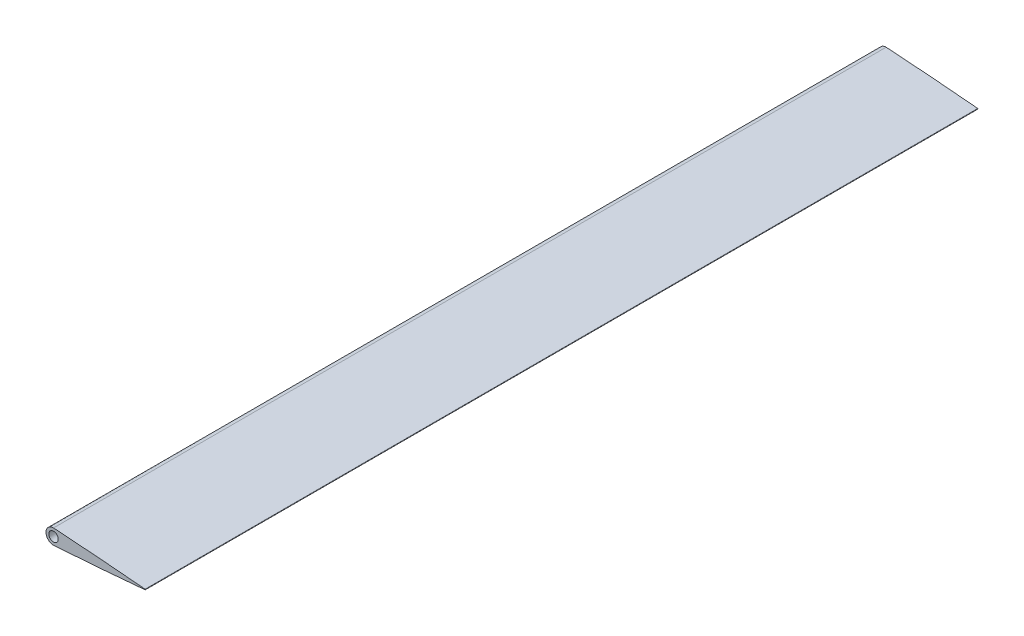
ISO-10303-21;
HEADER;
FILE_DESCRIPTION(('STEP AP214'),'2;1');
FILE_NAME('part.step','',(''),(''),'','','');
FILE_SCHEMA(('AUTOMOTIVE_DESIGN { 1 0 10303 214 1 1 1 1 }'));
ENDSEC;
DATA;
#1=APPLICATION_CONTEXT('core data for automotive mechanical design processes');
#2=APPLICATION_PROTOCOL_DEFINITION('international standard','automotive_design',2000,#1);
#3=PRODUCT_CONTEXT('',#1,'mechanical');
#4=PRODUCT('Part','Part','',(#3));
#5=PRODUCT_RELATED_PRODUCT_CATEGORY('part','',(#4));
#6=PRODUCT_DEFINITION_FORMATION('','',#4);
#7=PRODUCT_DEFINITION_CONTEXT('part definition',#1,'design');
#8=PRODUCT_DEFINITION('design','',#6,#7);
#9=PRODUCT_DEFINITION_SHAPE('','',#8);
#10=(LENGTH_UNIT() NAMED_UNIT(*) SI_UNIT(.MILLI.,.METRE.));
#11=(NAMED_UNIT(*) PLANE_ANGLE_UNIT() SI_UNIT($,.RADIAN.));
#12=(NAMED_UNIT(*) SI_UNIT($,.STERADIAN.) SOLID_ANGLE_UNIT());
#13=UNCERTAINTY_MEASURE_WITH_UNIT(LENGTH_MEASURE(1.E-05),#10,'distance_accuracy_value','');
#14=(GEOMETRIC_REPRESENTATION_CONTEXT(3) GLOBAL_UNCERTAINTY_ASSIGNED_CONTEXT((#13)) GLOBAL_UNIT_ASSIGNED_CONTEXT((#10,
#11,#12)) REPRESENTATION_CONTEXT('',''));
#15=CARTESIAN_POINT('',(0.,0.,0.));
#16=DIRECTION('',(0.,0.,1.));
#17=DIRECTION('',(1.,0.,0.));
#18=AXIS2_PLACEMENT_3D('',#15,#16,#17);
#19=CARTESIAN_POINT('',(100.,0.0839999999999999,263.67));
#20=CARTESIAN_POINT('',(98.3334888148662,0.236746480060598,263.67));
#21=CARTESIAN_POINT('',(95.001194725225,0.542172688573306,263.67));
#22=CARTESIAN_POINT('',(88.3355596207202,1.11089898019156,263.67));
#23=CARTESIAN_POINT('',(80.3363209284794,1.73752312296761,263.67));
#24=CARTESIAN_POINT('',(74.0008291045769,2.18017191098458,263.67));
#25=CARTESIAN_POINT('',(70.9999999988377,2.377645078217,263.67));
#26=B_SPLINE_CURVE_WITH_KNOTS('',3,(#19,#20,#21,#22,#23,#24,#25),.UNSPECIFIED.,.F.,.F.,(4,1,1,1,
4),(0.,0.0248762929189861,0.0497417146704998,0.0994434021110951,0.144146709335921),.UNSPECIFIED.);
#27=DIRECTION('',(0.,0.,-1.));
#28=VECTOR('',#27,1.);
#29=SURFACE_OF_LINEAR_EXTRUSION('',#26,#28);
#30=CARTESIAN_POINT('',(100.,0.0839999999999999,0.));
#31=CARTESIAN_POINT('',(98.3334888148662,0.236746480060598,0.));
#32=CARTESIAN_POINT('',(95.001194725225,0.542172688573306,0.));
#33=CARTESIAN_POINT('',(88.3355596207202,1.11089898019156,0.));
#34=CARTESIAN_POINT('',(80.3363209284794,1.73752312296761,0.));
#35=CARTESIAN_POINT('',(74.0008291045769,2.18017191098458,0.));
#36=CARTESIAN_POINT('',(70.9999999988377,2.377645078217,0.));
#37=B_SPLINE_CURVE_WITH_KNOTS('',3,(#30,#31,#32,#33,#34,#35,#36),.UNSPECIFIED.,.F.,.F.,(4,1,1,1,
4),(0.,0.0248762929189861,0.0497417146704998,0.0994434021110951,0.144146709335921),.UNSPECIFIED.);
#38=CARTESIAN_POINT('',(100.,0.083999999946733,0.));
#39=VERTEX_POINT('',#38);
#40=CARTESIAN_POINT('',(70.9999999988377,2.377645078217,0.));
#41=VERTEX_POINT('',#40);
#42=EDGE_CURVE('E115',#39,#41,#37,.T.);
#43=ORIENTED_EDGE('',*,*,#42,.T.);
#44=DIRECTION('',(0.,0.,-1.));
#45=VECTOR('',#44,1.);
#46=CARTESIAN_POINT('',(70.9999999988377,2.377645078217,263.67));
#47=LINE('',#46,#45);
#48=CARTESIAN_POINT('',(70.9999999988377,2.377645078217,263.67));
#49=VERTEX_POINT('',#48);
#50=EDGE_CURVE('E11',#49,#41,#47,.T.);
#51=ORIENTED_EDGE('',*,*,#50,.F.);
#52=CARTESIAN_POINT('',(100.,0.083999999946733,263.67));
#53=VERTEX_POINT('',#52);
#54=EDGE_CURVE('E84',#53,#49,#26,.T.);
#55=ORIENTED_EDGE('',*,*,#54,.F.);
#56=DIRECTION('',(0.,0.,-1.));
#57=VECTOR('',#56,1.);
#58=CARTESIAN_POINT('',(100.,0.083999999946733,263.67));
#59=LINE('',#58,#57);
#60=EDGE_CURVE('E92',#53,#39,#59,.T.);
#61=ORIENTED_EDGE('',*,*,#60,.T.);
#62=EDGE_LOOP('',(#43,#51,#55,#61));
#63=FACE_BOUND('',#62,.T.);
#64=ADVANCED_FACE('F32',(#63),#29,.F.);
#65=CARTESIAN_POINT('',(70.9999999988377,0.,263.67));
#66=DIRECTION('',(0.,0.,-1.));
#67=DIRECTION('',(-1.,0.,0.));
#68=AXIS2_PLACEMENT_3D('',#65,#66,#67);
#69=CYLINDRICAL_SURFACE('',#68,2.377645078217);
#70=CARTESIAN_POINT('',(70.9999999988377,0.,0.));
#71=DIRECTION('',(0.,0.,1.));
#72=DIRECTION('',(1.,0.,0.));
#73=AXIS2_PLACEMENT_3D('',#70,#71,#72);
#74=CIRCLE('',#73,2.377645078217);
#75=CARTESIAN_POINT('',(70.9999999988293,-2.37764507821766,0.));
#76=VERTEX_POINT('',#75);
#77=EDGE_CURVE('E88',#41,#76,#74,.T.);
#78=ORIENTED_EDGE('',*,*,#77,.T.);
#79=DIRECTION('',(0.,0.,-1.));
#80=VECTOR('',#79,1.);
#81=CARTESIAN_POINT('',(70.9999999988293,-2.37764507821766,263.67));
#82=LINE('',#81,#80);
#83=CARTESIAN_POINT('',(70.9999999988293,-2.37764507821766,263.67));
#84=VERTEX_POINT('',#83);
#85=EDGE_CURVE('E41',#84,#76,#82,.T.);
#86=ORIENTED_EDGE('',*,*,#85,.F.);
#87=CARTESIAN_POINT('',(70.9999999988377,0.,263.67));
#88=DIRECTION('',(0.,0.,1.));
#89=DIRECTION('',(1.,0.,0.));
#90=AXIS2_PLACEMENT_3D('',#87,#88,#89);
#91=CIRCLE('',#90,2.377645078217);
#92=EDGE_CURVE('E79',#49,#84,#91,.T.);
#93=ORIENTED_EDGE('',*,*,#92,.F.);
#94=ORIENTED_EDGE('',*,*,#50,.T.);
#95=EDGE_LOOP('',(#78,#86,#93,#94));
#96=FACE_BOUND('',#95,.T.);
#97=ADVANCED_FACE('F87',(#96),#69,.T.);
#98=CARTESIAN_POINT('',(70.9999999988293,-2.37764507821766,263.67));
#99=CARTESIAN_POINT('',(74.0008291044505,-2.18017191099453,263.67));
#100=CARTESIAN_POINT('',(80.3363209281016,-1.73752312299831,263.67));
#101=CARTESIAN_POINT('',(88.3355596200245,-1.11089898025118,263.67));
#102=CARTESIAN_POINT('',(95.0011947242627,-0.542172688659006,263.67));
#103=CARTESIAN_POINT('',(98.3334888137706,-0.236746480160186,263.67));
#104=CARTESIAN_POINT('',(99.9999999988377,-0.0840000001065339,263.67));
#105=B_SPLINE_CURVE_WITH_KNOTS('',3,(#98,#99,#100,#101,#102,#103,#104),.UNSPECIFIED.,.F.,.F.,(4,
1,1,1,4),(0.855853290664049,0.900556597888905,0.9502582853295,0.975123707081014,1.),.UNSPECIFIED.);
#106=DIRECTION('',(0.,0.,-1.));
#107=VECTOR('',#106,1.);
#108=SURFACE_OF_LINEAR_EXTRUSION('',#105,#107);
#109=CARTESIAN_POINT('',(70.9999999988293,-2.37764507821766,0.));
#110=CARTESIAN_POINT('',(74.0008291044505,-2.18017191099453,0.));
#111=CARTESIAN_POINT('',(80.3363209281016,-1.73752312299831,0.));
#112=CARTESIAN_POINT('',(88.3355596200245,-1.11089898025118,0.));
#113=CARTESIAN_POINT('',(95.0011947242627,-0.542172688659006,0.));
#114=CARTESIAN_POINT('',(98.3334888137706,-0.236746480160186,0.));
#115=CARTESIAN_POINT('',(99.9999999988377,-0.0840000001065339,0.));
#116=B_SPLINE_CURVE_WITH_KNOTS('',3,(#109,#110,#111,#112,#113,#114,#115),.UNSPECIFIED.,.F.,.F.,
(4,1,1,1,4),(0.855853290664049,0.900556597888905,0.9502582853295,0.975123707081014,1.),.UNSPECIFIED.);
#117=CARTESIAN_POINT('',(99.9999999988377,-0.0840000001598009,0.));
#118=VERTEX_POINT('',#117);
#119=EDGE_CURVE('E66',#76,#118,#116,.T.);
#120=ORIENTED_EDGE('',*,*,#119,.T.);
#121=DIRECTION('',(0.,0.,-1.));
#122=VECTOR('',#121,1.);
#123=CARTESIAN_POINT('',(99.9999999988377,-0.0840000001598009,263.67));
#124=LINE('',#123,#122);
#125=CARTESIAN_POINT('',(99.9999999988377,-0.0840000001598009,263.67));
#126=VERTEX_POINT('',#125);
#127=EDGE_CURVE('E89',#126,#118,#124,.T.);
#128=ORIENTED_EDGE('',*,*,#127,.F.);
#129=EDGE_CURVE('E82',#84,#126,#105,.T.);
#130=ORIENTED_EDGE('',*,*,#129,.F.);
#131=ORIENTED_EDGE('',*,*,#85,.T.);
#132=EDGE_LOOP('',(#120,#128,#130,#131));
#133=FACE_BOUND('',#132,.T.);
#134=ADVANCED_FACE('F90',(#133),#108,.F.);
#135=CARTESIAN_POINT('',(99.9999999988377,-1.06533908756333E-10,263.67));
#136=DIRECTION('',(0.,0.,-1.));
#137=DIRECTION('',(-1.,0.,0.));
#138=AXIS2_PLACEMENT_3D('',#135,#136,#137);
#139=CYLINDRICAL_SURFACE('',#138,0.084000000053267);
#140=CARTESIAN_POINT('',(99.9999999988377,-1.06533908756333E-10,0.));
#141=DIRECTION('',(0.,0.,1.));
#142=DIRECTION('',(-1.,0.,0.));
#143=AXIS2_PLACEMENT_3D('',#140,#141,#142);
#144=CIRCLE('',#143,0.084000000053267);
#145=EDGE_CURVE('E72',#118,#39,#144,.T.);
#146=ORIENTED_EDGE('',*,*,#145,.T.);
#147=ORIENTED_EDGE('',*,*,#60,.F.);
#148=CARTESIAN_POINT('',(99.9999999988377,-1.06533908756333E-10,263.67));
#149=DIRECTION('',(0.,0.,1.));
#150=DIRECTION('',(-1.,0.,0.));
#151=AXIS2_PLACEMENT_3D('',#148,#149,#150);
#152=CIRCLE('',#151,0.084000000053267);
#153=EDGE_CURVE('E49',#126,#53,#152,.T.);
#154=ORIENTED_EDGE('',*,*,#153,.F.);
#155=ORIENTED_EDGE('',*,*,#127,.T.);
#156=EDGE_LOOP('',(#146,#147,#154,#155));
#157=FACE_BOUND('',#156,.T.);
#158=ADVANCED_FACE('F104',(#157),#139,.T.);
#159=CARTESIAN_POINT('',(85.5077466886652,1.32847743631037,263.67));
#160=DIRECTION('',(0.,0.,-1.));
#161=DIRECTION('',(-1.,0.,0.));
#162=AXIS2_PLACEMENT_3D('',#159,#160,#161);
#163=PLANE('',#162);
#164=CARTESIAN_POINT('',(70.9999999988377,0.,263.67));
#165=DIRECTION('',(0.,0.,1.));
#166=DIRECTION('',(1.,0.,0.));
#167=AXIS2_PLACEMENT_3D('',#164,#165,#166);
#168=CIRCLE('',#167,1.5);
#169=CARTESIAN_POINT('',(72.4999999988377,0.,263.67));
#170=VERTEX_POINT('',#169);
#171=EDGE_CURVE('E120',#170,#170,#168,.T.);
#172=ORIENTED_EDGE('',*,*,#171,.F.);
#173=EDGE_LOOP('',(#172));
#174=FACE_BOUND('',#173,.T.);
#175=ORIENTED_EDGE('',*,*,#54,.T.);
#176=ORIENTED_EDGE('',*,*,#92,.T.);
#177=ORIENTED_EDGE('',*,*,#129,.T.);
#178=ORIENTED_EDGE('',*,*,#153,.T.);
#179=EDGE_LOOP('',(#175,#176,#177,#178));
#180=FACE_BOUND('',#179,.T.);
#181=ADVANCED_FACE('F80',(#174,#180),#163,.F.);
#182=CARTESIAN_POINT('',(85.5077466886652,1.32847743631037,0.));
#183=DIRECTION('',(0.,0.,-1.));
#184=DIRECTION('',(-1.,0.,0.));
#185=AXIS2_PLACEMENT_3D('',#182,#183,#184);
#186=PLANE('',#185);
#187=CARTESIAN_POINT('',(70.9999999988377,0.,0.));
#188=DIRECTION('',(0.,0.,1.));
#189=DIRECTION('',(1.,0.,0.));
#190=AXIS2_PLACEMENT_3D('',#187,#188,#189);
#191=CIRCLE('',#190,1.5);
#192=CARTESIAN_POINT('',(72.4999999988377,0.,0.));
#193=VERTEX_POINT('',#192);
#194=EDGE_CURVE('E117',#193,#193,#191,.T.);
#195=ORIENTED_EDGE('',*,*,#194,.T.);
#196=EDGE_LOOP('',(#195));
#197=FACE_BOUND('',#196,.T.);
#198=ORIENTED_EDGE('',*,*,#42,.F.);
#199=ORIENTED_EDGE('',*,*,#145,.F.);
#200=ORIENTED_EDGE('',*,*,#119,.F.);
#201=ORIENTED_EDGE('',*,*,#77,.F.);
#202=EDGE_LOOP('',(#198,#199,#200,#201));
#203=FACE_BOUND('',#202,.T.);
#204=ADVANCED_FACE('F136',(#197,#203),#186,.T.);
#205=CARTESIAN_POINT('',(70.9999999988377,0.,0.));
#206=DIRECTION('',(0.,0.,1.));
#207=DIRECTION('',(1.,0.,0.));
#208=AXIS2_PLACEMENT_3D('',#205,#206,#207);
#209=CYLINDRICAL_SURFACE('',#208,1.5);
#210=ORIENTED_EDGE('',*,*,#194,.F.);
#211=EDGE_LOOP('',(#210));
#212=FACE_BOUND('',#211,.T.);
#213=ORIENTED_EDGE('',*,*,#171,.T.);
#214=EDGE_LOOP('',(#213));
#215=FACE_BOUND('',#214,.T.);
#216=ADVANCED_FACE('F138',(#212,#215),#209,.F.);
#217=CLOSED_SHELL('',(#64,#97,#134,#158,#181,#204,#216));
#218=MANIFOLD_SOLID_BREP('B2',#217);
#219=ADVANCED_BREP_SHAPE_REPRESENTATION('',(#18,#218),#14);
#220=SHAPE_DEFINITION_REPRESENTATION(#9,#219);
ENDSEC;
END-ISO-10303-21;
